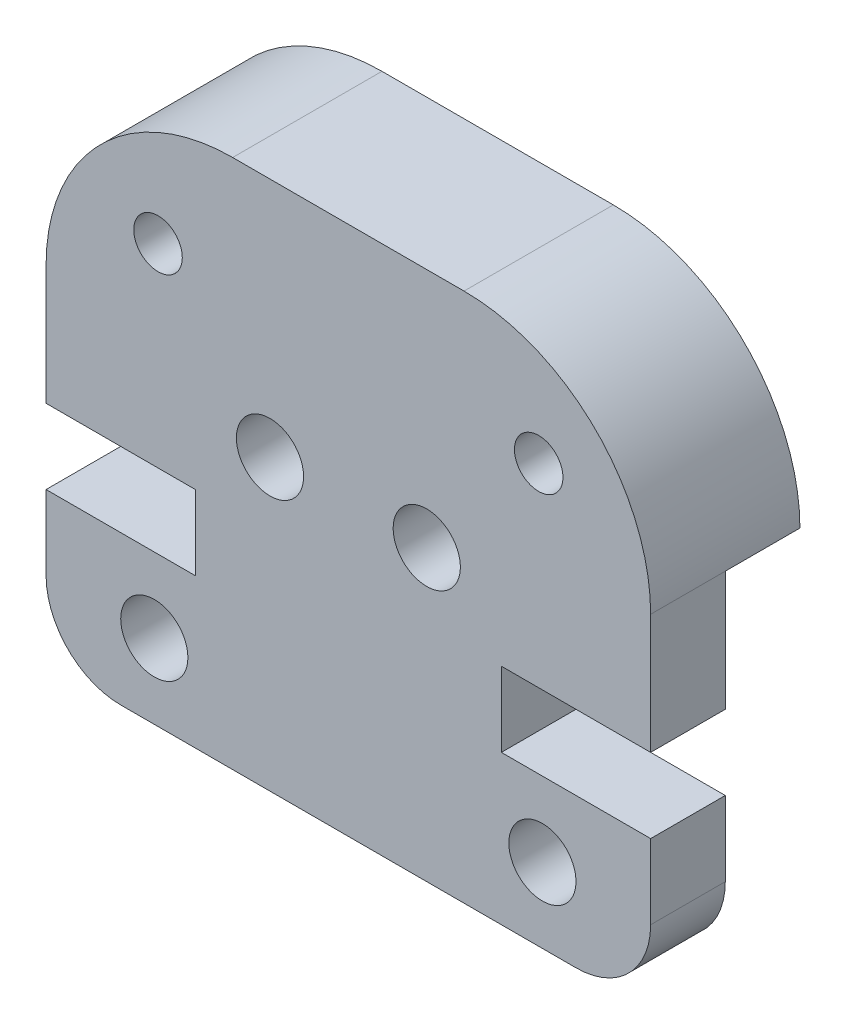
ISO-10303-21;
HEADER;
FILE_DESCRIPTION(('STEP AP214'),'2;1');
FILE_NAME('part.step','',(''),(''),'','','');
FILE_SCHEMA(('AUTOMOTIVE_DESIGN { 1 0 10303 214 1 1 1 1 }'));
ENDSEC;
DATA;
#1=APPLICATION_CONTEXT('core data for automotive mechanical design processes');
#2=APPLICATION_PROTOCOL_DEFINITION('international standard','automotive_design',2000,#1);
#3=PRODUCT_CONTEXT('',#1,'mechanical');
#4=PRODUCT('Part','Part','',(#3));
#5=PRODUCT_RELATED_PRODUCT_CATEGORY('part','',(#4));
#6=PRODUCT_DEFINITION_FORMATION('','',#4);
#7=PRODUCT_DEFINITION_CONTEXT('part definition',#1,'design');
#8=PRODUCT_DEFINITION('design','',#6,#7);
#9=PRODUCT_DEFINITION_SHAPE('','',#8);
#10=(LENGTH_UNIT() NAMED_UNIT(*) SI_UNIT(.MILLI.,.METRE.));
#11=(NAMED_UNIT(*) PLANE_ANGLE_UNIT() SI_UNIT($,.RADIAN.));
#12=(NAMED_UNIT(*) SI_UNIT($,.STERADIAN.) SOLID_ANGLE_UNIT());
#13=UNCERTAINTY_MEASURE_WITH_UNIT(LENGTH_MEASURE(1.E-05),#10,'distance_accuracy_value','');
#14=(GEOMETRIC_REPRESENTATION_CONTEXT(3) GLOBAL_UNCERTAINTY_ASSIGNED_CONTEXT((#13)) GLOBAL_UNIT_ASSIGNED_CONTEXT((#10,
#11,#12)) REPRESENTATION_CONTEXT('',''));
#15=CARTESIAN_POINT('',(0.,0.,0.));
#16=DIRECTION('',(0.,0.,1.));
#17=DIRECTION('',(1.,0.,0.));
#18=AXIS2_PLACEMENT_3D('',#15,#16,#17);
#19=CARTESIAN_POINT('',(14.2,2.00000000000002,4.));
#20=DIRECTION('',(0.,0.,-1.));
#21=DIRECTION('',(-1.,0.,0.));
#22=AXIS2_PLACEMENT_3D('',#19,#20,#21);
#23=CYLINDRICAL_SURFACE('',#22,2.00000000000001);
#24=CARTESIAN_POINT('',(14.2,2.00000000000002,2.));
#25=DIRECTION('',(0.,0.,-1.));
#26=DIRECTION('',(-1.,0.,0.));
#27=AXIS2_PLACEMENT_3D('',#24,#25,#26);
#28=CIRCLE('',#27,2.00000000000001);
#29=CARTESIAN_POINT('',(16.2,2.00000000000002,2.));
#30=VERTEX_POINT('',#29);
#31=CARTESIAN_POINT('',(14.2,0.,2.));
#32=VERTEX_POINT('',#31);
#33=EDGE_CURVE('E47',#30,#32,#28,.T.);
#34=ORIENTED_EDGE('',*,*,#33,.F.);
#35=DIRECTION('',(0.,0.,-1.));
#36=VECTOR('',#35,1.);
#37=CARTESIAN_POINT('',(16.2,2.00000000000002,4.));
#38=LINE('',#37,#36);
#39=CARTESIAN_POINT('',(16.2,2.00000000000002,4.));
#40=VERTEX_POINT('',#39);
#41=EDGE_CURVE('E11',#40,#30,#38,.T.);
#42=ORIENTED_EDGE('',*,*,#41,.F.);
#43=CARTESIAN_POINT('',(14.2,2.00000000000002,4.));
#44=DIRECTION('',(0.,0.,1.));
#45=DIRECTION('',(-1.,0.,0.));
#46=AXIS2_PLACEMENT_3D('',#43,#44,#45);
#47=CIRCLE('',#46,2.00000000000001);
#48=CARTESIAN_POINT('',(14.2,0.,4.));
#49=VERTEX_POINT('',#48);
#50=EDGE_CURVE('E158',#49,#40,#47,.T.);
#51=ORIENTED_EDGE('',*,*,#50,.F.);
#52=DIRECTION('',(0.,0.,-1.));
#53=VECTOR('',#52,1.);
#54=CARTESIAN_POINT('',(14.2,0.,4.));
#55=LINE('',#54,#53);
#56=EDGE_CURVE('E147',#49,#32,#55,.T.);
#57=ORIENTED_EDGE('',*,*,#56,.T.);
#58=EDGE_LOOP('',(#34,#42,#51,#57));
#59=FACE_BOUND('',#58,.T.);
#60=ADVANCED_FACE('F32',(#59),#23,.T.);
#61=CARTESIAN_POINT('',(16.2,2.00000000000002,4.));
#62=DIRECTION('',(-1.,0.,0.));
#63=DIRECTION('',(0.,0.,1.));
#64=AXIS2_PLACEMENT_3D('',#61,#62,#63);
#65=PLANE('',#64);
#66=DIRECTION('',(0.,-1.,0.));
#67=VECTOR('',#66,1.);
#68=CARTESIAN_POINT('',(16.2,9.205,2.));
#69=LINE('',#68,#67);
#70=CARTESIAN_POINT('',(16.2,4.00000000000002,2.));
#71=VERTEX_POINT('',#70);
#72=EDGE_CURVE('E206',#71,#30,#69,.T.);
#73=ORIENTED_EDGE('',*,*,#72,.F.);
#74=DIRECTION('',(0.,0.,-1.));
#75=VECTOR('',#74,1.);
#76=CARTESIAN_POINT('',(16.2,4.00000000000002,4.));
#77=LINE('',#76,#75);
#78=CARTESIAN_POINT('',(16.2,4.00000000000002,4.));
#79=VERTEX_POINT('',#78);
#80=EDGE_CURVE('E40',#79,#71,#77,.T.);
#81=ORIENTED_EDGE('',*,*,#80,.F.);
#82=DIRECTION('',(0.,1.,0.));
#83=VECTOR('',#82,1.);
#84=CARTESIAN_POINT('',(16.2,2.00000000000002,4.));
#85=LINE('',#84,#83);
#86=EDGE_CURVE('E80',#40,#79,#85,.T.);
#87=ORIENTED_EDGE('',*,*,#86,.F.);
#88=ORIENTED_EDGE('',*,*,#41,.T.);
#89=EDGE_LOOP('',(#73,#81,#87,#88));
#90=FACE_BOUND('',#89,.T.);
#91=ADVANCED_FACE('F205',(#90),#65,.F.);
#92=CARTESIAN_POINT('',(12.2,4.00000000000002,4.));
#93=DIRECTION('',(0.,-1.,0.));
#94=DIRECTION('',(1.,0.,0.));
#95=AXIS2_PLACEMENT_3D('',#92,#93,#94);
#96=PLANE('',#95);
#97=DIRECTION('',(1.,0.,0.));
#98=VECTOR('',#97,1.);
#99=CARTESIAN_POINT('',(12.2,4.00000000000002,2.));
#100=LINE('',#99,#98);
#101=CARTESIAN_POINT('',(12.2,4.00000000000002,2.));
#102=VERTEX_POINT('',#101);
#103=EDGE_CURVE('E199',#102,#71,#100,.T.);
#104=ORIENTED_EDGE('',*,*,#103,.F.);
#105=DIRECTION('',(0.,0.,-1.));
#106=VECTOR('',#105,1.);
#107=CARTESIAN_POINT('',(12.2,4.00000000000002,4.));
#108=LINE('',#107,#106);
#109=CARTESIAN_POINT('',(12.2,4.00000000000002,4.));
#110=VERTEX_POINT('',#109);
#111=EDGE_CURVE('E188',#110,#102,#108,.T.);
#112=ORIENTED_EDGE('',*,*,#111,.F.);
#113=DIRECTION('',(-1.,0.,0.));
#114=VECTOR('',#113,1.);
#115=CARTESIAN_POINT('',(12.2,4.00000000000002,4.));
#116=LINE('',#115,#114);
#117=EDGE_CURVE('E200',#79,#110,#116,.T.);
#118=ORIENTED_EDGE('',*,*,#117,.F.);
#119=ORIENTED_EDGE('',*,*,#80,.T.);
#120=EDGE_LOOP('',(#104,#112,#118,#119));
#121=FACE_BOUND('',#120,.T.);
#122=ADVANCED_FACE('F196',(#121),#96,.F.);
#123=CARTESIAN_POINT('',(12.2,6.00000000000003,4.));
#124=DIRECTION('',(-1.,0.,0.));
#125=DIRECTION('',(0.,-1.,0.));
#126=AXIS2_PLACEMENT_3D('',#123,#124,#125);
#127=PLANE('',#126);
#128=DIRECTION('',(0.,-1.,0.));
#129=VECTOR('',#128,1.);
#130=CARTESIAN_POINT('',(12.2,6.00000000000003,2.));
#131=LINE('',#130,#129);
#132=CARTESIAN_POINT('',(12.2,6.00000000000003,2.));
#133=VERTEX_POINT('',#132);
#134=EDGE_CURVE('E250',#133,#102,#131,.T.);
#135=ORIENTED_EDGE('',*,*,#134,.F.);
#136=DIRECTION('',(0.,0.,-1.));
#137=VECTOR('',#136,1.);
#138=CARTESIAN_POINT('',(12.2,6.00000000000003,4.));
#139=LINE('',#138,#137);
#140=CARTESIAN_POINT('',(12.2,6.00000000000003,4.));
#141=VERTEX_POINT('',#140);
#142=EDGE_CURVE('E185',#141,#133,#139,.T.);
#143=ORIENTED_EDGE('',*,*,#142,.F.);
#144=DIRECTION('',(0.,1.,0.));
#145=VECTOR('',#144,1.);
#146=CARTESIAN_POINT('',(12.2,6.00000000000003,4.));
#147=LINE('',#146,#145);
#148=EDGE_CURVE('E281',#110,#141,#147,.T.);
#149=ORIENTED_EDGE('',*,*,#148,.F.);
#150=ORIENTED_EDGE('',*,*,#111,.T.);
#151=EDGE_LOOP('',(#135,#143,#149,#150));
#152=FACE_BOUND('',#151,.T.);
#153=ADVANCED_FACE('F324',(#152),#127,.F.);
#154=CARTESIAN_POINT('',(16.2,6.00000000000003,4.));
#155=DIRECTION('',(0.,1.,0.));
#156=DIRECTION('',(-1.,0.,0.));
#157=AXIS2_PLACEMENT_3D('',#154,#155,#156);
#158=PLANE('',#157);
#159=DIRECTION('',(-1.,0.,0.));
#160=VECTOR('',#159,1.);
#161=CARTESIAN_POINT('',(16.2,6.00000000000003,2.));
#162=LINE('',#161,#160);
#163=CARTESIAN_POINT('',(16.2,6.00000000000003,2.));
#164=VERTEX_POINT('',#163);
#165=EDGE_CURVE('E247',#164,#133,#162,.T.);
#166=ORIENTED_EDGE('',*,*,#165,.F.);
#167=DIRECTION('',(0.,0.,-1.));
#168=VECTOR('',#167,1.);
#169=CARTESIAN_POINT('',(16.2,6.00000000000003,4.));
#170=LINE('',#169,#168);
#171=CARTESIAN_POINT('',(16.2,6.00000000000003,4.));
#172=VERTEX_POINT('',#171);
#173=EDGE_CURVE('E182',#172,#164,#170,.T.);
#174=ORIENTED_EDGE('',*,*,#173,.F.);
#175=DIRECTION('',(1.,0.,0.));
#176=VECTOR('',#175,1.);
#177=CARTESIAN_POINT('',(16.2,6.00000000000003,4.));
#178=LINE('',#177,#176);
#179=EDGE_CURVE('E283',#141,#172,#178,.T.);
#180=ORIENTED_EDGE('',*,*,#179,.F.);
#181=ORIENTED_EDGE('',*,*,#142,.T.);
#182=EDGE_LOOP('',(#166,#174,#180,#181));
#183=FACE_BOUND('',#182,.T.);
#184=ADVANCED_FACE('F328',(#183),#158,.F.);
#185=CARTESIAN_POINT('',(16.2,9.205,4.));
#186=DIRECTION('',(-1.,0.,0.));
#187=DIRECTION('',(0.,-1.,0.));
#188=AXIS2_PLACEMENT_3D('',#185,#186,#187);
#189=PLANE('',#188);
#190=CARTESIAN_POINT('',(16.2,9.205,2.));
#191=VERTEX_POINT('',#190);
#192=EDGE_CURVE('E208',#191,#164,#69,.T.);
#193=ORIENTED_EDGE('',*,*,#192,.F.);
#194=DIRECTION('',(0.,0.,-1.));
#195=VECTOR('',#194,1.);
#196=CARTESIAN_POINT('',(16.2,9.205,4.));
#197=LINE('',#196,#195);
#198=CARTESIAN_POINT('',(16.2,9.205,4.));
#199=VERTEX_POINT('',#198);
#200=EDGE_CURVE('E179',#199,#191,#197,.T.);
#201=ORIENTED_EDGE('',*,*,#200,.F.);
#202=DIRECTION('',(0.,1.,0.));
#203=VECTOR('',#202,1.);
#204=CARTESIAN_POINT('',(16.2,9.205,4.));
#205=LINE('',#204,#203);
#206=EDGE_CURVE('E285',#172,#199,#205,.T.);
#207=ORIENTED_EDGE('',*,*,#206,.F.);
#208=ORIENTED_EDGE('',*,*,#173,.T.);
#209=EDGE_LOOP('',(#193,#201,#207,#208));
#210=FACE_BOUND('',#209,.T.);
#211=ADVANCED_FACE('F375',(#210),#189,.F.);
#212=CARTESIAN_POINT('',(0.,9.20499999999999,4.));
#213=DIRECTION('',(1.,0.,0.));
#214=DIRECTION('',(0.,0.,-1.));
#215=AXIS2_PLACEMENT_3D('',#212,#213,#214);
#216=PLANE('',#215);
#217=DIRECTION('',(0.,1.,0.));
#218=VECTOR('',#217,1.);
#219=CARTESIAN_POINT('',(0.,0.,2.));
#220=LINE('',#219,#218);
#221=CARTESIAN_POINT('',(0.,6.00000000000003,2.));
#222=VERTEX_POINT('',#221);
#223=CARTESIAN_POINT('',(0.,9.20499999999999,2.));
#224=VERTEX_POINT('',#223);
#225=EDGE_CURVE('E348',#222,#224,#220,.T.);
#226=ORIENTED_EDGE('',*,*,#225,.F.);
#227=DIRECTION('',(0.,0.,-1.));
#228=VECTOR('',#227,1.);
#229=CARTESIAN_POINT('',(0.,6.00000000000003,4.));
#230=LINE('',#229,#228);
#231=CARTESIAN_POINT('',(0.,6.00000000000003,4.));
#232=VERTEX_POINT('',#231);
#233=EDGE_CURVE('E169',#232,#222,#230,.T.);
#234=ORIENTED_EDGE('',*,*,#233,.F.);
#235=DIRECTION('',(0.,-1.,0.));
#236=VECTOR('',#235,1.);
#237=CARTESIAN_POINT('',(0.,9.20499999999999,4.));
#238=LINE('',#237,#236);
#239=CARTESIAN_POINT('',(0.,9.20499999999999,4.));
#240=VERTEX_POINT('',#239);
#241=EDGE_CURVE('E293',#240,#232,#238,.T.);
#242=ORIENTED_EDGE('',*,*,#241,.F.);
#243=DIRECTION('',(0.,0.,-1.));
#244=VECTOR('',#243,1.);
#245=CARTESIAN_POINT('',(0.,9.20499999999999,4.));
#246=LINE('',#245,#244);
#247=EDGE_CURVE('E172',#240,#224,#246,.T.);
#248=ORIENTED_EDGE('',*,*,#247,.T.);
#249=EDGE_LOOP('',(#226,#234,#242,#248));
#250=FACE_BOUND('',#249,.T.);
#251=ADVANCED_FACE('F364',(#250),#216,.F.);
#252=CARTESIAN_POINT('',(0.,6.00000000000003,4.));
#253=DIRECTION('',(0.,1.,0.));
#254=DIRECTION('',(-1.,0.,0.));
#255=AXIS2_PLACEMENT_3D('',#252,#253,#254);
#256=PLANE('',#255);
#257=DIRECTION('',(-1.,0.,0.));
#258=VECTOR('',#257,1.);
#259=CARTESIAN_POINT('',(0.,6.00000000000003,2.));
#260=LINE('',#259,#258);
#261=CARTESIAN_POINT('',(4.00000000000001,6.00000000000003,2.));
#262=VERTEX_POINT('',#261);
#263=EDGE_CURVE('E244',#262,#222,#260,.T.);
#264=ORIENTED_EDGE('',*,*,#263,.F.);
#265=DIRECTION('',(0.,0.,-1.));
#266=VECTOR('',#265,1.);
#267=CARTESIAN_POINT('',(4.00000000000001,6.00000000000003,4.));
#268=LINE('',#267,#266);
#269=CARTESIAN_POINT('',(4.00000000000001,6.00000000000003,4.));
#270=VERTEX_POINT('',#269);
#271=EDGE_CURVE('E166',#270,#262,#268,.T.);
#272=ORIENTED_EDGE('',*,*,#271,.F.);
#273=DIRECTION('',(1.,0.,0.));
#274=VECTOR('',#273,1.);
#275=CARTESIAN_POINT('',(0.,6.00000000000003,4.));
#276=LINE('',#275,#274);
#277=EDGE_CURVE('E295',#232,#270,#276,.T.);
#278=ORIENTED_EDGE('',*,*,#277,.F.);
#279=ORIENTED_EDGE('',*,*,#233,.T.);
#280=EDGE_LOOP('',(#264,#272,#278,#279));
#281=FACE_BOUND('',#280,.T.);
#282=ADVANCED_FACE('F382',(#281),#256,.F.);
#283=CARTESIAN_POINT('',(4.00000000000001,6.00000000000003,4.));
#284=DIRECTION('',(1.,0.,0.));
#285=DIRECTION('',(0.,0.,-1.));
#286=AXIS2_PLACEMENT_3D('',#283,#284,#285);
#287=PLANE('',#286);
#288=DIRECTION('',(0.,1.,0.));
#289=VECTOR('',#288,1.);
#290=CARTESIAN_POINT('',(4.00000000000001,6.00000000000003,2.));
#291=LINE('',#290,#289);
#292=CARTESIAN_POINT('',(4.00000000000001,4.00000000000002,2.));
#293=VERTEX_POINT('',#292);
#294=EDGE_CURVE('E241',#293,#262,#291,.T.);
#295=ORIENTED_EDGE('',*,*,#294,.F.);
#296=DIRECTION('',(0.,0.,-1.));
#297=VECTOR('',#296,1.);
#298=CARTESIAN_POINT('',(4.00000000000001,4.00000000000002,4.));
#299=LINE('',#298,#297);
#300=CARTESIAN_POINT('',(4.00000000000001,4.00000000000002,4.));
#301=VERTEX_POINT('',#300);
#302=EDGE_CURVE('E163',#301,#293,#299,.T.);
#303=ORIENTED_EDGE('',*,*,#302,.F.);
#304=DIRECTION('',(0.,-1.,0.));
#305=VECTOR('',#304,1.);
#306=CARTESIAN_POINT('',(4.00000000000001,6.00000000000003,4.));
#307=LINE('',#306,#305);
#308=EDGE_CURVE('E297',#270,#301,#307,.T.);
#309=ORIENTED_EDGE('',*,*,#308,.F.);
#310=ORIENTED_EDGE('',*,*,#271,.T.);
#311=EDGE_LOOP('',(#295,#303,#309,#310));
#312=FACE_BOUND('',#311,.T.);
#313=ADVANCED_FACE('F304',(#312),#287,.F.);
#314=CARTESIAN_POINT('',(4.00000000000001,4.00000000000002,4.));
#315=DIRECTION('',(0.,-1.,0.));
#316=DIRECTION('',(1.,0.,0.));
#317=AXIS2_PLACEMENT_3D('',#314,#315,#316);
#318=PLANE('',#317);
#319=DIRECTION('',(1.,0.,0.));
#320=VECTOR('',#319,1.);
#321=CARTESIAN_POINT('',(4.00000000000001,4.00000000000002,2.));
#322=LINE('',#321,#320);
#323=CARTESIAN_POINT('',(0.,4.00000000000003,2.));
#324=VERTEX_POINT('',#323);
#325=EDGE_CURVE('E238',#324,#293,#322,.T.);
#326=ORIENTED_EDGE('',*,*,#325,.F.);
#327=DIRECTION('',(0.,0.,-1.));
#328=VECTOR('',#327,1.);
#329=CARTESIAN_POINT('',(0.,4.00000000000003,4.));
#330=LINE('',#329,#328);
#331=CARTESIAN_POINT('',(0.,4.00000000000003,4.));
#332=VERTEX_POINT('',#331);
#333=EDGE_CURVE('E141',#332,#324,#330,.T.);
#334=ORIENTED_EDGE('',*,*,#333,.F.);
#335=DIRECTION('',(-1.,0.,0.));
#336=VECTOR('',#335,1.);
#337=CARTESIAN_POINT('',(4.00000000000001,4.00000000000002,4.));
#338=LINE('',#337,#336);
#339=EDGE_CURVE('E127',#301,#332,#338,.T.);
#340=ORIENTED_EDGE('',*,*,#339,.F.);
#341=ORIENTED_EDGE('',*,*,#302,.T.);
#342=EDGE_LOOP('',(#326,#334,#340,#341));
#343=FACE_BOUND('',#342,.T.);
#344=ADVANCED_FACE('F308',(#343),#318,.F.);
#345=CARTESIAN_POINT('',(0.,2.00000000000001,4.));
#346=DIRECTION('',(1.,0.,0.));
#347=DIRECTION('',(0.,0.,-1.));
#348=AXIS2_PLACEMENT_3D('',#345,#346,#347);
#349=PLANE('',#348);
#350=CARTESIAN_POINT('',(0.,2.00000000000001,2.));
#351=VERTEX_POINT('',#350);
#352=EDGE_CURVE('E138',#351,#324,#220,.T.);
#353=ORIENTED_EDGE('',*,*,#352,.F.);
#354=DIRECTION('',(0.,0.,-1.));
#355=VECTOR('',#354,1.);
#356=CARTESIAN_POINT('',(0.,2.00000000000001,4.));
#357=LINE('',#356,#355);
#358=CARTESIAN_POINT('',(0.,2.00000000000001,4.));
#359=VERTEX_POINT('',#358);
#360=EDGE_CURVE('E134',#359,#351,#357,.T.);
#361=ORIENTED_EDGE('',*,*,#360,.F.);
#362=DIRECTION('',(0.,-1.,0.));
#363=VECTOR('',#362,1.);
#364=CARTESIAN_POINT('',(0.,2.00000000000001,4.));
#365=LINE('',#364,#363);
#366=EDGE_CURVE('E119',#332,#359,#365,.T.);
#367=ORIENTED_EDGE('',*,*,#366,.F.);
#368=ORIENTED_EDGE('',*,*,#333,.T.);
#369=EDGE_LOOP('',(#353,#361,#367,#368));
#370=FACE_BOUND('',#369,.T.);
#371=ADVANCED_FACE('F135',(#370),#349,.F.);
#372=CARTESIAN_POINT('',(2.,2.00000000000001,4.));
#373=DIRECTION('',(0.,0.,-1.));
#374=DIRECTION('',(-1.,0.,0.));
#375=AXIS2_PLACEMENT_3D('',#372,#373,#374);
#376=CYLINDRICAL_SURFACE('',#375,2.00000000000001);
#377=CARTESIAN_POINT('',(2.,2.00000000000001,2.));
#378=DIRECTION('',(0.,0.,-1.));
#379=DIRECTION('',(-1.,0.,0.));
#380=AXIS2_PLACEMENT_3D('',#377,#378,#379);
#381=CIRCLE('',#380,2.00000000000001);
#382=CARTESIAN_POINT('',(2.,0.,2.));
#383=VERTEX_POINT('',#382);
#384=EDGE_CURVE('E235',#383,#351,#381,.T.);
#385=ORIENTED_EDGE('',*,*,#384,.F.);
#386=DIRECTION('',(0.,0.,-1.));
#387=VECTOR('',#386,1.);
#388=CARTESIAN_POINT('',(2.,0.,4.));
#389=LINE('',#388,#387);
#390=CARTESIAN_POINT('',(2.,0.,4.));
#391=VERTEX_POINT('',#390);
#392=EDGE_CURVE('E142',#391,#383,#389,.T.);
#393=ORIENTED_EDGE('',*,*,#392,.F.);
#394=CARTESIAN_POINT('',(2.,2.00000000000001,4.));
#395=DIRECTION('',(0.,0.,1.));
#396=DIRECTION('',(1.,0.,0.));
#397=AXIS2_PLACEMENT_3D('',#394,#395,#396);
#398=CIRCLE('',#397,2.00000000000001);
#399=EDGE_CURVE('E124',#359,#391,#398,.T.);
#400=ORIENTED_EDGE('',*,*,#399,.F.);
#401=ORIENTED_EDGE('',*,*,#360,.T.);
#402=EDGE_LOOP('',(#385,#393,#400,#401));
#403=FACE_BOUND('',#402,.T.);
#404=ADVANCED_FACE('F144',(#403),#376,.T.);
#405=CARTESIAN_POINT('',(2.,0.,4.));
#406=DIRECTION('',(0.,1.,0.));
#407=DIRECTION('',(-1.,0.,0.));
#408=AXIS2_PLACEMENT_3D('',#405,#406,#407);
#409=PLANE('',#408);
#410=DIRECTION('',(-1.,0.,0.));
#411=VECTOR('',#410,1.);
#412=CARTESIAN_POINT('',(16.2,0.,2.));
#413=LINE('',#412,#411);
#414=EDGE_CURVE('E220',#32,#383,#413,.T.);
#415=ORIENTED_EDGE('',*,*,#414,.F.);
#416=ORIENTED_EDGE('',*,*,#56,.F.);
#417=DIRECTION('',(1.,0.,0.));
#418=VECTOR('',#417,1.);
#419=CARTESIAN_POINT('',(2.,0.,4.));
#420=LINE('',#419,#418);
#421=EDGE_CURVE('E56',#391,#49,#420,.T.);
#422=ORIENTED_EDGE('',*,*,#421,.F.);
#423=ORIENTED_EDGE('',*,*,#392,.T.);
#424=EDGE_LOOP('',(#415,#416,#422,#423));
#425=FACE_BOUND('',#424,.T.);
#426=ADVANCED_FACE('F456',(#425),#409,.F.);
#427=CARTESIAN_POINT('',(13.3,2.00000000000002,4.));
#428=DIRECTION('',(0.,0.,-1.));
#429=DIRECTION('',(-1.,0.,0.));
#430=AXIS2_PLACEMENT_3D('',#427,#428,#429);
#431=CYLINDRICAL_SURFACE('',#430,0.9);
#432=CARTESIAN_POINT('',(13.3,2.00000000000002,4.));
#433=DIRECTION('',(0.,0.,1.));
#434=DIRECTION('',(-1.,0.,0.));
#435=AXIS2_PLACEMENT_3D('',#432,#433,#434);
#436=CIRCLE('',#435,0.9);
#437=CARTESIAN_POINT('',(12.4,2.00000000000002,4.));
#438=VERTEX_POINT('',#437);
#439=EDGE_CURVE('E153',#438,#438,#436,.T.);
#440=ORIENTED_EDGE('',*,*,#439,.T.);
#441=EDGE_LOOP('',(#440));
#442=FACE_BOUND('',#441,.T.);
#443=CARTESIAN_POINT('',(13.3,2.00000000000002,2.));
#444=DIRECTION('',(0.,0.,-1.));
#445=DIRECTION('',(-1.,0.,0.));
#446=AXIS2_PLACEMENT_3D('',#443,#444,#445);
#447=CIRCLE('',#446,0.9);
#448=CARTESIAN_POINT('',(12.4,2.00000000000002,2.));
#449=VERTEX_POINT('',#448);
#450=EDGE_CURVE('E232',#449,#449,#447,.T.);
#451=ORIENTED_EDGE('',*,*,#450,.T.);
#452=EDGE_LOOP('',(#451));
#453=FACE_BOUND('',#452,.T.);
#454=ADVANCED_FACE('F465',(#442,#453),#431,.F.);
#455=CARTESIAN_POINT('',(10.2000000000053,7.75,4.));
#456=DIRECTION('',(0.,0.,-1.));
#457=DIRECTION('',(-1.,0.,0.));
#458=AXIS2_PLACEMENT_3D('',#455,#456,#457);
#459=CYLINDRICAL_SURFACE('',#458,0.9);
#460=CARTESIAN_POINT('',(10.2000000000053,7.75,4.));
#461=DIRECTION('',(0.,0.,1.));
#462=DIRECTION('',(-1.,0.,0.));
#463=AXIS2_PLACEMENT_3D('',#460,#461,#462);
#464=CIRCLE('',#463,0.9);
#465=CARTESIAN_POINT('',(9.30000000000532,7.75,4.));
#466=VERTEX_POINT('',#465);
#467=EDGE_CURVE('E267',#466,#466,#464,.T.);
#468=ORIENTED_EDGE('',*,*,#467,.T.);
#469=EDGE_LOOP('',(#468));
#470=FACE_BOUND('',#469,.T.);
#471=CARTESIAN_POINT('',(10.2000000000053,7.75,2.));
#472=DIRECTION('',(0.,0.,-1.));
#473=DIRECTION('',(-1.,0.,0.));
#474=AXIS2_PLACEMENT_3D('',#471,#472,#473);
#475=CIRCLE('',#474,0.9);
#476=CARTESIAN_POINT('',(9.30000000000532,7.75,2.));
#477=VERTEX_POINT('',#476);
#478=EDGE_CURVE('E229',#477,#477,#475,.T.);
#479=ORIENTED_EDGE('',*,*,#478,.T.);
#480=EDGE_LOOP('',(#479));
#481=FACE_BOUND('',#480,.T.);
#482=ADVANCED_FACE('F475',(#470,#481),#459,.F.);
#483=CARTESIAN_POINT('',(5.99999999999468,7.75,4.));
#484=DIRECTION('',(0.,0.,-1.));
#485=DIRECTION('',(-1.,0.,0.));
#486=AXIS2_PLACEMENT_3D('',#483,#484,#485);
#487=CYLINDRICAL_SURFACE('',#486,0.899999999999999);
#488=CARTESIAN_POINT('',(5.99999999999468,7.75,4.));
#489=DIRECTION('',(0.,0.,1.));
#490=DIRECTION('',(1.,0.,0.));
#491=AXIS2_PLACEMENT_3D('',#488,#489,#490);
#492=CIRCLE('',#491,0.899999999999999);
#493=CARTESIAN_POINT('',(6.89999999999467,7.75,4.));
#494=VERTEX_POINT('',#493);
#495=EDGE_CURVE('E262',#494,#494,#492,.T.);
#496=ORIENTED_EDGE('',*,*,#495,.T.);
#497=EDGE_LOOP('',(#496));
#498=FACE_BOUND('',#497,.T.);
#499=CARTESIAN_POINT('',(5.99999999999468,7.75,2.));
#500=DIRECTION('',(0.,0.,-1.));
#501=DIRECTION('',(-1.,0.,0.));
#502=AXIS2_PLACEMENT_3D('',#499,#500,#501);
#503=CIRCLE('',#502,0.899999999999999);
#504=CARTESIAN_POINT('',(5.09999999999468,7.75,2.));
#505=VERTEX_POINT('',#504);
#506=EDGE_CURVE('E226',#505,#505,#503,.T.);
#507=ORIENTED_EDGE('',*,*,#506,.T.);
#508=EDGE_LOOP('',(#507));
#509=FACE_BOUND('',#508,.T.);
#510=ADVANCED_FACE('F485',(#498,#509),#487,.F.);
#511=CARTESIAN_POINT('',(2.9,2.00000000000002,4.));
#512=DIRECTION('',(0.,0.,-1.));
#513=DIRECTION('',(-1.,0.,0.));
#514=AXIS2_PLACEMENT_3D('',#511,#512,#513);
#515=CYLINDRICAL_SURFACE('',#514,0.9);
#516=CARTESIAN_POINT('',(2.9,2.00000000000002,4.));
#517=DIRECTION('',(0.,0.,1.));
#518=DIRECTION('',(1.,0.,0.));
#519=AXIS2_PLACEMENT_3D('',#516,#517,#518);
#520=CIRCLE('',#519,0.9);
#521=CARTESIAN_POINT('',(3.8,2.00000000000002,4.));
#522=VERTEX_POINT('',#521);
#523=EDGE_CURVE('E255',#522,#522,#520,.T.);
#524=ORIENTED_EDGE('',*,*,#523,.T.);
#525=EDGE_LOOP('',(#524));
#526=FACE_BOUND('',#525,.T.);
#527=CARTESIAN_POINT('',(2.9,2.00000000000002,2.));
#528=DIRECTION('',(0.,0.,-1.));
#529=DIRECTION('',(-1.,0.,0.));
#530=AXIS2_PLACEMENT_3D('',#527,#528,#529);
#531=CIRCLE('',#530,0.9);
#532=CARTESIAN_POINT('',(2.,2.00000000000002,2.));
#533=VERTEX_POINT('',#532);
#534=EDGE_CURVE('E35',#533,#533,#531,.T.);
#535=ORIENTED_EDGE('',*,*,#534,.T.);
#536=EDGE_LOOP('',(#535));
#537=FACE_BOUND('',#536,.T.);
#538=ADVANCED_FACE('F495',(#526,#537),#515,.F.);
#539=CARTESIAN_POINT('',(14.2,2.00000000000002,4.));
#540=DIRECTION('',(0.,0.,-1.));
#541=DIRECTION('',(-1.,0.,0.));
#542=AXIS2_PLACEMENT_3D('',#539,#540,#541);
#543=PLANE('',#542);
#544=CARTESIAN_POINT('',(3.00000000000434,11.2049999999999,4.));
#545=DIRECTION('',(0.,0.,1.));
#546=DIRECTION('',(1.,0.,0.));
#547=AXIS2_PLACEMENT_3D('',#544,#545,#546);
#548=CIRCLE('',#547,0.65);
#549=CARTESIAN_POINT('',(3.65000000000434,11.2049999999999,4.));
#550=VERTEX_POINT('',#549);
#551=EDGE_CURVE('E259',#550,#550,#548,.T.);
#552=ORIENTED_EDGE('',*,*,#551,.F.);
#553=EDGE_LOOP('',(#552));
#554=FACE_BOUND('',#553,.T.);
#555=ORIENTED_EDGE('',*,*,#467,.F.);
#556=EDGE_LOOP('',(#555));
#557=FACE_BOUND('',#556,.T.);
#558=ORIENTED_EDGE('',*,*,#439,.F.);
#559=EDGE_LOOP('',(#558));
#560=FACE_BOUND('',#559,.T.);
#561=ORIENTED_EDGE('',*,*,#50,.T.);
#562=ORIENTED_EDGE('',*,*,#86,.T.);
#563=ORIENTED_EDGE('',*,*,#117,.T.);
#564=ORIENTED_EDGE('',*,*,#148,.T.);
#565=ORIENTED_EDGE('',*,*,#179,.T.);
#566=ORIENTED_EDGE('',*,*,#206,.T.);
#567=CARTESIAN_POINT('',(11.2,9.20499999999999,4.));
#568=DIRECTION('',(0.,0.,1.));
#569=DIRECTION('',(-1.,0.,0.));
#570=AXIS2_PLACEMENT_3D('',#567,#568,#569);
#571=CIRCLE('',#570,5.);
#572=CARTESIAN_POINT('',(11.2,14.205,4.));
#573=VERTEX_POINT('',#572);
#574=EDGE_CURVE('E287',#199,#573,#571,.T.);
#575=ORIENTED_EDGE('',*,*,#574,.T.);
#576=DIRECTION('',(-1.,0.,0.));
#577=VECTOR('',#576,1.);
#578=CARTESIAN_POINT('',(5.,14.205,4.));
#579=LINE('',#578,#577);
#580=CARTESIAN_POINT('',(5.,14.205,4.));
#581=VERTEX_POINT('',#580);
#582=EDGE_CURVE('E289',#573,#581,#579,.T.);
#583=ORIENTED_EDGE('',*,*,#582,.T.);
#584=CARTESIAN_POINT('',(5.,9.20499999999999,4.));
#585=DIRECTION('',(0.,0.,1.));
#586=DIRECTION('',(1.,0.,0.));
#587=AXIS2_PLACEMENT_3D('',#584,#585,#586);
#588=CIRCLE('',#587,5.);
#589=EDGE_CURVE('E291',#581,#240,#588,.T.);
#590=ORIENTED_EDGE('',*,*,#589,.T.);
#591=ORIENTED_EDGE('',*,*,#241,.T.);
#592=ORIENTED_EDGE('',*,*,#277,.T.);
#593=ORIENTED_EDGE('',*,*,#308,.T.);
#594=ORIENTED_EDGE('',*,*,#339,.T.);
#595=ORIENTED_EDGE('',*,*,#366,.T.);
#596=ORIENTED_EDGE('',*,*,#399,.T.);
#597=ORIENTED_EDGE('',*,*,#421,.T.);
#598=EDGE_LOOP('',(#561,#562,#563,#564,#565,#566,#575,#583,#590,#591,#592,#593,#594,#595,#596,#597));
#599=FACE_BOUND('',#598,.T.);
#600=CARTESIAN_POINT('',(13.1999999999957,11.2049999999999,4.));
#601=DIRECTION('',(0.,0.,1.));
#602=DIRECTION('',(-1.,0.,0.));
#603=AXIS2_PLACEMENT_3D('',#600,#601,#602);
#604=CIRCLE('',#603,0.649999999999999);
#605=CARTESIAN_POINT('',(12.5499999999957,11.2049999999999,4.));
#606=VERTEX_POINT('',#605);
#607=EDGE_CURVE('E271',#606,#606,#604,.T.);
#608=ORIENTED_EDGE('',*,*,#607,.F.);
#609=EDGE_LOOP('',(#608));
#610=FACE_BOUND('',#609,.T.);
#611=ORIENTED_EDGE('',*,*,#495,.F.);
#612=EDGE_LOOP('',(#611));
#613=FACE_BOUND('',#612,.T.);
#614=ORIENTED_EDGE('',*,*,#523,.F.);
#615=EDGE_LOOP('',(#614));
#616=FACE_BOUND('',#615,.T.);
#617=ADVANCED_FACE('F121',(#554,#557,#560,#599,#610,#613,#616),#543,.F.);
#618=CARTESIAN_POINT('',(14.2,2.00000000000002,0.));
#619=DIRECTION('',(0.,0.,-1.));
#620=DIRECTION('',(-1.,0.,0.));
#621=AXIS2_PLACEMENT_3D('',#618,#619,#620);
#622=PLANE('',#621);
#623=DIRECTION('',(1.,0.,0.));
#624=VECTOR('',#623,1.);
#625=CARTESIAN_POINT('',(0.,9.20499999999999,0.));
#626=LINE('',#625,#624);
#627=CARTESIAN_POINT('',(0.,9.20499999999999,0.));
#628=VERTEX_POINT('',#627);
#629=CARTESIAN_POINT('',(16.2,9.205,0.));
#630=VERTEX_POINT('',#629);
#631=EDGE_CURVE('E217',#628,#630,#626,.T.);
#632=ORIENTED_EDGE('',*,*,#631,.F.);
#633=CARTESIAN_POINT('',(5.,9.20499999999999,0.));
#634=DIRECTION('',(0.,0.,1.));
#635=DIRECTION('',(1.,0.,0.));
#636=AXIS2_PLACEMENT_3D('',#633,#634,#635);
#637=CIRCLE('',#636,5.);
#638=CARTESIAN_POINT('',(5.,14.205,0.));
#639=VERTEX_POINT('',#638);
#640=EDGE_CURVE('E155',#639,#628,#637,.T.);
#641=ORIENTED_EDGE('',*,*,#640,.F.);
#642=DIRECTION('',(-1.,0.,0.));
#643=VECTOR('',#642,1.);
#644=CARTESIAN_POINT('',(5.,14.205,0.));
#645=LINE('',#644,#643);
#646=CARTESIAN_POINT('',(11.2,14.205,0.));
#647=VERTEX_POINT('',#646);
#648=EDGE_CURVE('E72',#647,#639,#645,.T.);
#649=ORIENTED_EDGE('',*,*,#648,.F.);
#650=CARTESIAN_POINT('',(11.2,9.20499999999999,0.));
#651=DIRECTION('',(0.,0.,1.));
#652=DIRECTION('',(-1.,0.,0.));
#653=AXIS2_PLACEMENT_3D('',#650,#651,#652);
#654=CIRCLE('',#653,5.);
#655=EDGE_CURVE('E151',#630,#647,#654,.T.);
#656=ORIENTED_EDGE('',*,*,#655,.F.);
#657=EDGE_LOOP('',(#632,#641,#649,#656));
#658=FACE_BOUND('',#657,.T.);
#659=CARTESIAN_POINT('',(3.00000000000434,11.2049999999999,0.));
#660=DIRECTION('',(0.,0.,1.));
#661=DIRECTION('',(1.,0.,0.));
#662=AXIS2_PLACEMENT_3D('',#659,#660,#661);
#663=CIRCLE('',#662,0.65);
#664=CARTESIAN_POINT('',(3.65000000000434,11.2049999999999,0.));
#665=VERTEX_POINT('',#664);
#666=EDGE_CURVE('E258',#665,#665,#663,.T.);
#667=ORIENTED_EDGE('',*,*,#666,.T.);
#668=EDGE_LOOP('',(#667));
#669=FACE_BOUND('',#668,.T.);
#670=CARTESIAN_POINT('',(13.1999999999957,11.2049999999999,0.));
#671=DIRECTION('',(0.,0.,1.));
#672=DIRECTION('',(-1.,0.,0.));
#673=AXIS2_PLACEMENT_3D('',#670,#671,#672);
#674=CIRCLE('',#673,0.649999999999999);
#675=CARTESIAN_POINT('',(12.5499999999957,11.2049999999999,0.));
#676=VERTEX_POINT('',#675);
#677=EDGE_CURVE('E270',#676,#676,#674,.T.);
#678=ORIENTED_EDGE('',*,*,#677,.T.);
#679=EDGE_LOOP('',(#678));
#680=FACE_BOUND('',#679,.T.);
#681=ADVANCED_FACE('F367',(#658,#669,#680),#622,.T.);
#682=CARTESIAN_POINT('',(11.2,9.20499999999999,4.));
#683=DIRECTION('',(0.,0.,-1.));
#684=DIRECTION('',(-1.,0.,0.));
#685=AXIS2_PLACEMENT_3D('',#682,#683,#684);
#686=CYLINDRICAL_SURFACE('',#685,5.);
#687=ORIENTED_EDGE('',*,*,#655,.T.);
#688=DIRECTION('',(0.,0.,-1.));
#689=VECTOR('',#688,1.);
#690=CARTESIAN_POINT('',(11.2,14.205,4.));
#691=LINE('',#690,#689);
#692=EDGE_CURVE('E177',#573,#647,#691,.T.);
#693=ORIENTED_EDGE('',*,*,#692,.F.);
#694=ORIENTED_EDGE('',*,*,#574,.F.);
#695=ORIENTED_EDGE('',*,*,#200,.T.);
#696=DIRECTION('',(0.,0.,-1.));
#697=VECTOR('',#696,1.);
#698=CARTESIAN_POINT('',(16.2,9.205,2.));
#699=LINE('',#698,#697);
#700=EDGE_CURVE('E221',#191,#630,#699,.T.);
#701=ORIENTED_EDGE('',*,*,#700,.T.);
#702=EDGE_LOOP('',(#687,#693,#694,#695,#701));
#703=FACE_BOUND('',#702,.T.);
#704=ADVANCED_FACE('F371',(#703),#686,.T.);
#705=CARTESIAN_POINT('',(5.,14.205,4.));
#706=DIRECTION('',(0.,-1.,0.));
#707=DIRECTION('',(0.,0.,-1.));
#708=AXIS2_PLACEMENT_3D('',#705,#706,#707);
#709=PLANE('',#708);
#710=ORIENTED_EDGE('',*,*,#648,.T.);
#711=DIRECTION('',(0.,0.,-1.));
#712=VECTOR('',#711,1.);
#713=CARTESIAN_POINT('',(5.,14.205,4.));
#714=LINE('',#713,#712);
#715=EDGE_CURVE('E175',#581,#639,#714,.T.);
#716=ORIENTED_EDGE('',*,*,#715,.F.);
#717=ORIENTED_EDGE('',*,*,#582,.F.);
#718=ORIENTED_EDGE('',*,*,#692,.T.);
#719=EDGE_LOOP('',(#710,#716,#717,#718));
#720=FACE_BOUND('',#719,.T.);
#721=ADVANCED_FACE('F525',(#720),#709,.F.);
#722=CARTESIAN_POINT('',(5.,9.20499999999999,4.));
#723=DIRECTION('',(0.,0.,-1.));
#724=DIRECTION('',(-1.,0.,0.));
#725=AXIS2_PLACEMENT_3D('',#722,#723,#724);
#726=CYLINDRICAL_SURFACE('',#725,5.);
#727=ORIENTED_EDGE('',*,*,#640,.T.);
#728=DIRECTION('',(0.,0.,-1.));
#729=VECTOR('',#728,1.);
#730=CARTESIAN_POINT('',(0.,9.20499999999999,2.));
#731=LINE('',#730,#729);
#732=EDGE_CURVE('E212',#224,#628,#731,.T.);
#733=ORIENTED_EDGE('',*,*,#732,.F.);
#734=ORIENTED_EDGE('',*,*,#247,.F.);
#735=ORIENTED_EDGE('',*,*,#589,.F.);
#736=ORIENTED_EDGE('',*,*,#715,.T.);
#737=EDGE_LOOP('',(#727,#733,#734,#735,#736));
#738=FACE_BOUND('',#737,.T.);
#739=ADVANCED_FACE('F360',(#738),#726,.T.);
#740=CARTESIAN_POINT('',(13.1999999999957,11.2049999999999,4.));
#741=DIRECTION('',(0.,0.,-1.));
#742=DIRECTION('',(-1.,0.,0.));
#743=AXIS2_PLACEMENT_3D('',#740,#741,#742);
#744=CYLINDRICAL_SURFACE('',#743,0.649999999999999);
#745=ORIENTED_EDGE('',*,*,#607,.T.);
#746=EDGE_LOOP('',(#745));
#747=FACE_BOUND('',#746,.T.);
#748=ORIENTED_EDGE('',*,*,#677,.F.);
#749=EDGE_LOOP('',(#748));
#750=FACE_BOUND('',#749,.T.);
#751=ADVANCED_FACE('F535',(#747,#750),#744,.F.);
#752=CARTESIAN_POINT('',(3.00000000000434,11.2049999999999,4.));
#753=DIRECTION('',(0.,0.,-1.));
#754=DIRECTION('',(-1.,0.,0.));
#755=AXIS2_PLACEMENT_3D('',#752,#753,#754);
#756=CYLINDRICAL_SURFACE('',#755,0.65);
#757=ORIENTED_EDGE('',*,*,#551,.T.);
#758=EDGE_LOOP('',(#757));
#759=FACE_BOUND('',#758,.T.);
#760=ORIENTED_EDGE('',*,*,#666,.F.);
#761=EDGE_LOOP('',(#760));
#762=FACE_BOUND('',#761,.T.);
#763=ADVANCED_FACE('F546',(#759,#762),#756,.F.);
#764=CARTESIAN_POINT('',(0.,0.,2.));
#765=DIRECTION('',(0.,0.,-1.));
#766=DIRECTION('',(-1.,0.,0.));
#767=AXIS2_PLACEMENT_3D('',#764,#765,#766);
#768=PLANE('',#767);
#769=ORIENTED_EDGE('',*,*,#450,.F.);
#770=EDGE_LOOP('',(#769));
#771=FACE_BOUND('',#770,.T.);
#772=ORIENTED_EDGE('',*,*,#478,.F.);
#773=EDGE_LOOP('',(#772));
#774=FACE_BOUND('',#773,.T.);
#775=ORIENTED_EDGE('',*,*,#506,.F.);
#776=EDGE_LOOP('',(#775));
#777=FACE_BOUND('',#776,.T.);
#778=ORIENTED_EDGE('',*,*,#534,.F.);
#779=EDGE_LOOP('',(#778));
#780=FACE_BOUND('',#779,.T.);
#781=ORIENTED_EDGE('',*,*,#33,.T.);
#782=ORIENTED_EDGE('',*,*,#414,.T.);
#783=ORIENTED_EDGE('',*,*,#384,.T.);
#784=ORIENTED_EDGE('',*,*,#352,.T.);
#785=ORIENTED_EDGE('',*,*,#325,.T.);
#786=ORIENTED_EDGE('',*,*,#294,.T.);
#787=ORIENTED_EDGE('',*,*,#263,.T.);
#788=ORIENTED_EDGE('',*,*,#225,.T.);
#789=DIRECTION('',(1.,0.,0.));
#790=VECTOR('',#789,1.);
#791=CARTESIAN_POINT('',(0.,9.20499999999999,2.));
#792=LINE('',#791,#790);
#793=EDGE_CURVE('E209',#224,#191,#792,.T.);
#794=ORIENTED_EDGE('',*,*,#793,.T.);
#795=ORIENTED_EDGE('',*,*,#192,.T.);
#796=ORIENTED_EDGE('',*,*,#165,.T.);
#797=ORIENTED_EDGE('',*,*,#134,.T.);
#798=ORIENTED_EDGE('',*,*,#103,.T.);
#799=ORIENTED_EDGE('',*,*,#72,.T.);
#800=EDGE_LOOP('',(#781,#782,#783,#784,#785,#786,#787,#788,#794,#795,#796,#797,#798,#799));
#801=FACE_BOUND('',#800,.T.);
#802=ADVANCED_FACE('F321',(#771,#774,#777,#780,#801),#768,.T.);
#803=CARTESIAN_POINT('',(0.,9.20499999999999,2.));
#804=DIRECTION('',(0.,1.,0.));
#805=DIRECTION('',(-1.,0.,0.));
#806=AXIS2_PLACEMENT_3D('',#803,#804,#805);
#807=PLANE('',#806);
#808=ORIENTED_EDGE('',*,*,#631,.T.);
#809=ORIENTED_EDGE('',*,*,#700,.F.);
#810=ORIENTED_EDGE('',*,*,#793,.F.);
#811=ORIENTED_EDGE('',*,*,#732,.T.);
#812=EDGE_LOOP('',(#808,#809,#810,#811));
#813=FACE_BOUND('',#812,.T.);
#814=ADVANCED_FACE('F356',(#813),#807,.F.);
#815=CLOSED_SHELL('',(#60,#91,#122,#153,#184,#211,#251,#282,#313,#344,#371,#404,#426,#454,#482,
#510,#538,#617,#681,#704,#721,#739,#751,#763,#802,#814));
#816=MANIFOLD_SOLID_BREP('B2',#815);
#817=ADVANCED_BREP_SHAPE_REPRESENTATION('',(#18,#816),#14);
#818=SHAPE_DEFINITION_REPRESENTATION(#9,#817);
ENDSEC;
END-ISO-10303-21;
